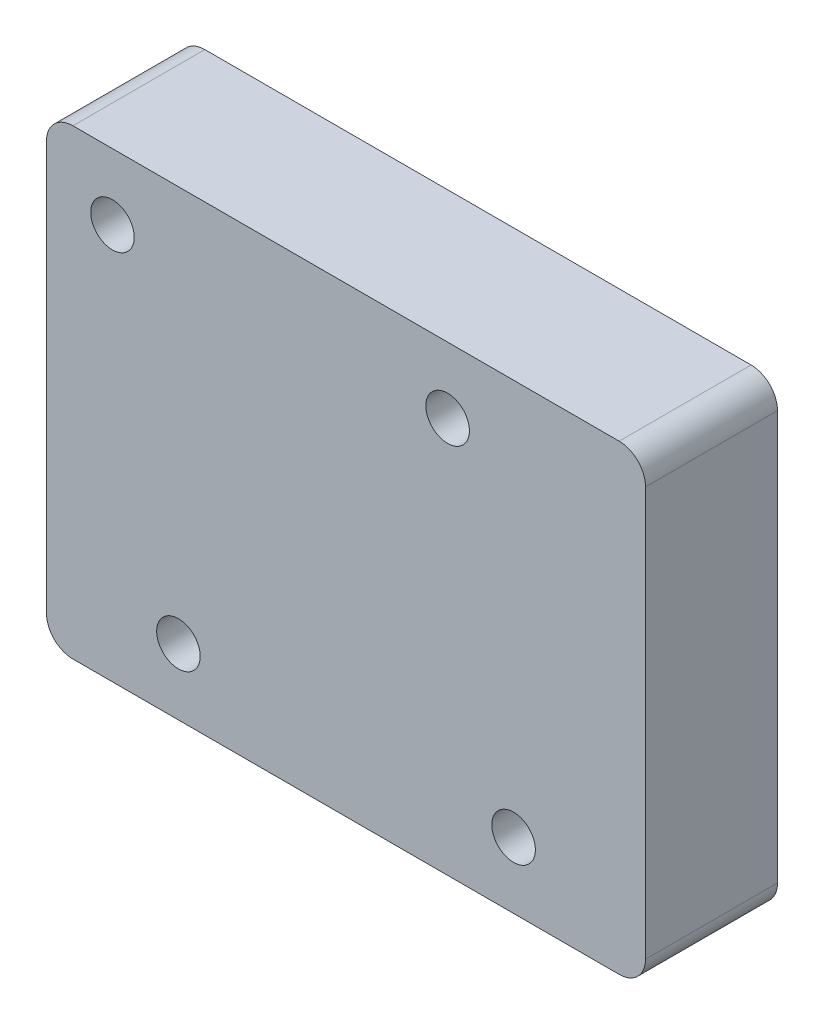
ISO-10303-21;
HEADER;
FILE_DESCRIPTION(('STEP AP214'),'2;1');
FILE_NAME('part.step','',(''),(''),'','','');
FILE_SCHEMA(('AUTOMOTIVE_DESIGN { 1 0 10303 214 1 1 1 1 }'));
ENDSEC;
DATA;
#1=APPLICATION_CONTEXT('core data for automotive mechanical design processes');
#2=APPLICATION_PROTOCOL_DEFINITION('international standard','automotive_design',2000,#1);
#3=PRODUCT_CONTEXT('',#1,'mechanical');
#4=PRODUCT('Part','Part','',(#3));
#5=PRODUCT_RELATED_PRODUCT_CATEGORY('part','',(#4));
#6=PRODUCT_DEFINITION_FORMATION('','',#4);
#7=PRODUCT_DEFINITION_CONTEXT('part definition',#1,'design');
#8=PRODUCT_DEFINITION('design','',#6,#7);
#9=PRODUCT_DEFINITION_SHAPE('','',#8);
#10=(LENGTH_UNIT() NAMED_UNIT(*) SI_UNIT(.MILLI.,.METRE.));
#11=(NAMED_UNIT(*) PLANE_ANGLE_UNIT() SI_UNIT($,.RADIAN.));
#12=(NAMED_UNIT(*) SI_UNIT($,.STERADIAN.) SOLID_ANGLE_UNIT());
#13=UNCERTAINTY_MEASURE_WITH_UNIT(LENGTH_MEASURE(1.E-05),#10,'distance_accuracy_value','');
#14=(GEOMETRIC_REPRESENTATION_CONTEXT(3) GLOBAL_UNCERTAINTY_ASSIGNED_CONTEXT((#13)) GLOBAL_UNIT_ASSIGNED_CONTEXT((#10,
#11,#12)) REPRESENTATION_CONTEXT('',''));
#15=CARTESIAN_POINT('',(0.,0.,0.));
#16=DIRECTION('',(0.,0.,1.));
#17=DIRECTION('',(1.,0.,0.));
#18=AXIS2_PLACEMENT_3D('',#15,#16,#17);
#19=CARTESIAN_POINT('',(0.,0.,10.));
#20=DIRECTION('',(0.,0.,-1.));
#21=DIRECTION('',(-1.,0.,0.));
#22=AXIS2_PLACEMENT_3D('',#19,#20,#21);
#23=PLANE('',#22);
#24=DIRECTION('',(1.,0.,0.));
#25=VECTOR('',#24,1.);
#26=CARTESIAN_POINT('',(0.,0.,10.));
#27=LINE('',#26,#25);
#28=CARTESIAN_POINT('',(2.,0.,10.));
#29=VERTEX_POINT('',#28);
#30=CARTESIAN_POINT('',(43.4,0.,10.));
#31=VERTEX_POINT('',#30);
#32=EDGE_CURVE('E243',#29,#31,#27,.T.);
#33=ORIENTED_EDGE('',*,*,#32,.T.);
#34=CARTESIAN_POINT('',(43.4,2.,10.));
#35=DIRECTION('',(0.,0.,-1.));
#36=DIRECTION('',(-1.,0.,0.));
#37=AXIS2_PLACEMENT_3D('',#34,#35,#36);
#38=CIRCLE('',#37,2.);
#39=CARTESIAN_POINT('',(45.4,2.,10.));
#40=VERTEX_POINT('',#39);
#41=EDGE_CURVE('E149',#31,#40,#38,.F.);
#42=ORIENTED_EDGE('',*,*,#41,.T.);
#43=DIRECTION('',(0.,1.,0.));
#44=VECTOR('',#43,1.);
#45=CARTESIAN_POINT('',(45.4,0.,10.));
#46=LINE('',#45,#44);
#47=CARTESIAN_POINT('',(45.4,33.,10.));
#48=VERTEX_POINT('',#47);
#49=EDGE_CURVE('E236',#40,#48,#46,.T.);
#50=ORIENTED_EDGE('',*,*,#49,.T.);
#51=CARTESIAN_POINT('',(43.4,33.,10.));
#52=DIRECTION('',(0.,0.,-1.));
#53=DIRECTION('',(-1.,0.,0.));
#54=AXIS2_PLACEMENT_3D('',#51,#52,#53);
#55=CIRCLE('',#54,2.);
#56=CARTESIAN_POINT('',(43.4,35.,10.));
#57=VERTEX_POINT('',#56);
#58=EDGE_CURVE('E147',#48,#57,#55,.F.);
#59=ORIENTED_EDGE('',*,*,#58,.T.);
#60=DIRECTION('',(-1.,0.,0.));
#61=VECTOR('',#60,1.);
#62=CARTESIAN_POINT('',(0.,35.,10.));
#63=LINE('',#62,#61);
#64=CARTESIAN_POINT('',(2.,35.,10.));
#65=VERTEX_POINT('',#64);
#66=EDGE_CURVE('E233',#57,#65,#63,.T.);
#67=ORIENTED_EDGE('',*,*,#66,.T.);
#68=CARTESIAN_POINT('',(2.,33.,10.));
#69=DIRECTION('',(0.,0.,-1.));
#70=DIRECTION('',(-1.,0.,0.));
#71=AXIS2_PLACEMENT_3D('',#68,#69,#70);
#72=CIRCLE('',#71,2.);
#73=CARTESIAN_POINT('',(0.,33.,10.));
#74=VERTEX_POINT('',#73);
#75=EDGE_CURVE('E143',#65,#74,#72,.F.);
#76=ORIENTED_EDGE('',*,*,#75,.T.);
#77=DIRECTION('',(0.,-1.,0.));
#78=VECTOR('',#77,1.);
#79=CARTESIAN_POINT('',(0.,0.,10.));
#80=LINE('',#79,#78);
#81=CARTESIAN_POINT('',(0.,2.,10.));
#82=VERTEX_POINT('',#81);
#83=EDGE_CURVE('E257',#74,#82,#80,.T.);
#84=ORIENTED_EDGE('',*,*,#83,.T.);
#85=CARTESIAN_POINT('',(2.,2.,10.));
#86=DIRECTION('',(0.,0.,-1.));
#87=DIRECTION('',(-1.,0.,0.));
#88=AXIS2_PLACEMENT_3D('',#85,#86,#87);
#89=CIRCLE('',#88,2.);
#90=EDGE_CURVE('E145',#82,#29,#89,.F.);
#91=ORIENTED_EDGE('',*,*,#90,.T.);
#92=EDGE_LOOP('',(#33,#42,#50,#59,#67,#76,#84,#91));
#93=FACE_BOUND('',#92,.T.);
#94=CARTESIAN_POINT('',(10.,5.,10.));
#95=DIRECTION('',(0.,0.,1.));
#96=DIRECTION('',(1.,0.,0.));
#97=AXIS2_PLACEMENT_3D('',#94,#95,#96);
#98=CIRCLE('',#97,1.65);
#99=CARTESIAN_POINT('',(11.65,5.,10.));
#100=VERTEX_POINT('',#99);
#101=EDGE_CURVE('E251',#100,#100,#98,.T.);
#102=ORIENTED_EDGE('',*,*,#101,.F.);
#103=EDGE_LOOP('',(#102));
#104=FACE_BOUND('',#103,.T.);
#105=CARTESIAN_POINT('',(35.4,5.,10.));
#106=DIRECTION('',(0.,0.,1.));
#107=DIRECTION('',(1.,0.,0.));
#108=AXIS2_PLACEMENT_3D('',#105,#106,#107);
#109=CIRCLE('',#108,1.65);
#110=CARTESIAN_POINT('',(37.05,5.,10.));
#111=VERTEX_POINT('',#110);
#112=EDGE_CURVE('E290',#111,#111,#109,.T.);
#113=ORIENTED_EDGE('',*,*,#112,.F.);
#114=EDGE_LOOP('',(#113));
#115=FACE_BOUND('',#114,.T.);
#116=CARTESIAN_POINT('',(5.,30.,10.));
#117=DIRECTION('',(0.,0.,1.));
#118=DIRECTION('',(1.,0.,0.));
#119=AXIS2_PLACEMENT_3D('',#116,#117,#118);
#120=CIRCLE('',#119,1.65);
#121=CARTESIAN_POINT('',(6.65,30.,10.));
#122=VERTEX_POINT('',#121);
#123=EDGE_CURVE('E284',#122,#122,#120,.T.);
#124=ORIENTED_EDGE('',*,*,#123,.F.);
#125=EDGE_LOOP('',(#124));
#126=FACE_BOUND('',#125,.T.);
#127=CARTESIAN_POINT('',(30.4,30.,10.));
#128=DIRECTION('',(0.,0.,1.));
#129=DIRECTION('',(1.,0.,0.));
#130=AXIS2_PLACEMENT_3D('',#127,#128,#129);
#131=CIRCLE('',#130,1.65);
#132=CARTESIAN_POINT('',(32.05,30.,10.));
#133=VERTEX_POINT('',#132);
#134=EDGE_CURVE('E277',#133,#133,#131,.T.);
#135=ORIENTED_EDGE('',*,*,#134,.F.);
#136=EDGE_LOOP('',(#135));
#137=FACE_BOUND('',#136,.T.);
#138=ADVANCED_FACE('F33',(#93,#104,#115,#126,#137),#23,.F.);
#139=CARTESIAN_POINT('',(0.,0.,0.));
#140=DIRECTION('',(0.,0.,-1.));
#141=DIRECTION('',(-1.,0.,0.));
#142=AXIS2_PLACEMENT_3D('',#139,#140,#141);
#143=PLANE('',#142);
#144=CARTESIAN_POINT('',(5.,30.,0.));
#145=DIRECTION('',(0.,0.,1.));
#146=DIRECTION('',(1.,0.,0.));
#147=AXIS2_PLACEMENT_3D('',#144,#145,#146);
#148=CIRCLE('',#147,1.65);
#149=CARTESIAN_POINT('',(6.65,30.,0.));
#150=VERTEX_POINT('',#149);
#151=EDGE_CURVE('E280',#150,#150,#148,.T.);
#152=ORIENTED_EDGE('',*,*,#151,.T.);
#153=EDGE_LOOP('',(#152));
#154=FACE_BOUND('',#153,.T.);
#155=CARTESIAN_POINT('',(10.,5.,0.));
#156=DIRECTION('',(0.,0.,1.));
#157=DIRECTION('',(1.,0.,0.));
#158=AXIS2_PLACEMENT_3D('',#155,#156,#157);
#159=CIRCLE('',#158,1.65);
#160=CARTESIAN_POINT('',(11.65,5.,0.));
#161=VERTEX_POINT('',#160);
#162=EDGE_CURVE('E293',#161,#161,#159,.T.);
#163=ORIENTED_EDGE('',*,*,#162,.T.);
#164=EDGE_LOOP('',(#163));
#165=FACE_BOUND('',#164,.T.);
#166=DIRECTION('',(0.,1.,0.));
#167=VECTOR('',#166,1.);
#168=CARTESIAN_POINT('',(45.4,0.,0.));
#169=LINE('',#168,#167);
#170=CARTESIAN_POINT('',(45.4,2.,0.));
#171=VERTEX_POINT('',#170);
#172=CARTESIAN_POINT('',(45.4,33.,0.));
#173=VERTEX_POINT('',#172);
#174=EDGE_CURVE('E253',#171,#173,#169,.T.);
#175=ORIENTED_EDGE('',*,*,#174,.F.);
#176=CARTESIAN_POINT('',(43.4,2.,0.));
#177=DIRECTION('',(0.,0.,-1.));
#178=DIRECTION('',(-1.,0.,0.));
#179=AXIS2_PLACEMENT_3D('',#176,#177,#178);
#180=CIRCLE('',#179,2.);
#181=CARTESIAN_POINT('',(43.4,0.,0.));
#182=VERTEX_POINT('',#181);
#183=EDGE_CURVE('E133',#171,#182,#180,.T.);
#184=ORIENTED_EDGE('',*,*,#183,.T.);
#185=DIRECTION('',(1.,0.,0.));
#186=VECTOR('',#185,1.);
#187=CARTESIAN_POINT('',(0.,0.,0.));
#188=LINE('',#187,#186);
#189=CARTESIAN_POINT('',(2.,0.,0.));
#190=VERTEX_POINT('',#189);
#191=EDGE_CURVE('E250',#190,#182,#188,.T.);
#192=ORIENTED_EDGE('',*,*,#191,.F.);
#193=CARTESIAN_POINT('',(2.,2.,0.));
#194=DIRECTION('',(0.,0.,-1.));
#195=DIRECTION('',(-1.,0.,0.));
#196=AXIS2_PLACEMENT_3D('',#193,#194,#195);
#197=CIRCLE('',#196,2.);
#198=CARTESIAN_POINT('',(0.,2.,0.));
#199=VERTEX_POINT('',#198);
#200=EDGE_CURVE('E131',#190,#199,#197,.T.);
#201=ORIENTED_EDGE('',*,*,#200,.T.);
#202=DIRECTION('',(0.,-1.,0.));
#203=VECTOR('',#202,1.);
#204=CARTESIAN_POINT('',(0.,0.,0.));
#205=LINE('',#204,#203);
#206=CARTESIAN_POINT('',(0.,33.,0.));
#207=VERTEX_POINT('',#206);
#208=EDGE_CURVE('E247',#207,#199,#205,.T.);
#209=ORIENTED_EDGE('',*,*,#208,.F.);
#210=CARTESIAN_POINT('',(2.,33.,0.));
#211=DIRECTION('',(0.,0.,-1.));
#212=DIRECTION('',(-1.,0.,0.));
#213=AXIS2_PLACEMENT_3D('',#210,#211,#212);
#214=CIRCLE('',#213,2.);
#215=CARTESIAN_POINT('',(2.,35.,0.));
#216=VERTEX_POINT('',#215);
#217=EDGE_CURVE('E261',#207,#216,#214,.T.);
#218=ORIENTED_EDGE('',*,*,#217,.T.);
#219=DIRECTION('',(-1.,0.,0.));
#220=VECTOR('',#219,1.);
#221=CARTESIAN_POINT('',(0.,35.,0.));
#222=LINE('',#221,#220);
#223=CARTESIAN_POINT('',(43.4,35.,0.));
#224=VERTEX_POINT('',#223);
#225=EDGE_CURVE('E256',#224,#216,#222,.T.);
#226=ORIENTED_EDGE('',*,*,#225,.F.);
#227=CARTESIAN_POINT('',(43.4,33.,0.));
#228=DIRECTION('',(0.,0.,-1.));
#229=DIRECTION('',(-1.,0.,0.));
#230=AXIS2_PLACEMENT_3D('',#227,#228,#229);
#231=CIRCLE('',#230,2.);
#232=EDGE_CURVE('E136',#224,#173,#231,.T.);
#233=ORIENTED_EDGE('',*,*,#232,.T.);
#234=EDGE_LOOP('',(#175,#184,#192,#201,#209,#218,#226,#233));
#235=FACE_BOUND('',#234,.T.);
#236=CARTESIAN_POINT('',(35.4,5.,0.));
#237=DIRECTION('',(0.,0.,1.));
#238=DIRECTION('',(1.,0.,0.));
#239=AXIS2_PLACEMENT_3D('',#236,#237,#238);
#240=CIRCLE('',#239,1.65);
#241=CARTESIAN_POINT('',(37.05,5.,0.));
#242=VERTEX_POINT('',#241);
#243=EDGE_CURVE('E287',#242,#242,#240,.T.);
#244=ORIENTED_EDGE('',*,*,#243,.T.);
#245=EDGE_LOOP('',(#244));
#246=FACE_BOUND('',#245,.T.);
#247=CARTESIAN_POINT('',(30.4,30.,0.));
#248=DIRECTION('',(0.,0.,1.));
#249=DIRECTION('',(1.,0.,0.));
#250=AXIS2_PLACEMENT_3D('',#247,#248,#249);
#251=CIRCLE('',#250,1.65);
#252=CARTESIAN_POINT('',(32.05,30.,0.));
#253=VERTEX_POINT('',#252);
#254=EDGE_CURVE('E281',#253,#253,#251,.T.);
#255=ORIENTED_EDGE('',*,*,#254,.T.);
#256=EDGE_LOOP('',(#255));
#257=FACE_BOUND('',#256,.T.);
#258=ADVANCED_FACE('F198',(#154,#165,#235,#246,#257),#143,.T.);
#259=CARTESIAN_POINT('',(0.,0.,10.));
#260=DIRECTION('',(1.,0.,0.));
#261=DIRECTION('',(0.,0.,-1.));
#262=AXIS2_PLACEMENT_3D('',#259,#260,#261);
#263=PLANE('',#262);
#264=ORIENTED_EDGE('',*,*,#208,.T.);
#265=DIRECTION('',(0.,0.,-1.));
#266=VECTOR('',#265,1.);
#267=CARTESIAN_POINT('',(0.,2.,10.));
#268=LINE('',#267,#266);
#269=EDGE_CURVE('E118',#199,#82,#268,.F.);
#270=ORIENTED_EDGE('',*,*,#269,.T.);
#271=ORIENTED_EDGE('',*,*,#83,.F.);
#272=DIRECTION('',(0.,0.,-1.));
#273=VECTOR('',#272,1.);
#274=CARTESIAN_POINT('',(0.,33.,10.));
#275=LINE('',#274,#273);
#276=EDGE_CURVE('E156',#74,#207,#275,.T.);
#277=ORIENTED_EDGE('',*,*,#276,.T.);
#278=EDGE_LOOP('',(#264,#270,#271,#277));
#279=FACE_BOUND('',#278,.T.);
#280=ADVANCED_FACE('F202',(#279),#263,.F.);
#281=CARTESIAN_POINT('',(0.,0.,10.));
#282=DIRECTION('',(0.,1.,0.));
#283=DIRECTION('',(0.,0.,1.));
#284=AXIS2_PLACEMENT_3D('',#281,#282,#283);
#285=PLANE('',#284);
#286=DIRECTION('',(0.,0.,-1.));
#287=VECTOR('',#286,1.);
#288=CARTESIAN_POINT('',(2.,0.,10.));
#289=LINE('',#288,#287);
#290=CARTESIAN_POINT('',(2.,0.,6.49415527974839));
#291=VERTEX_POINT('',#290);
#292=EDGE_CURVE('E125',#29,#291,#289,.T.);
#293=ORIENTED_EDGE('',*,*,#292,.T.);
#294=CARTESIAN_POINT('',(2.7,0.,5.));
#295=DIRECTION('',(0.,-1.,0.));
#296=DIRECTION('',(0.,0.,-1.));
#297=AXIS2_PLACEMENT_3D('',#294,#295,#296);
#298=CIRCLE('',#297,1.65);
#299=CARTESIAN_POINT('',(2.,0.,3.50584472025161));
#300=VERTEX_POINT('',#299);
#301=EDGE_CURVE('E59',#300,#291,#298,.T.);
#302=ORIENTED_EDGE('',*,*,#301,.F.);
#303=EDGE_CURVE('E122',#300,#190,#289,.T.);
#304=ORIENTED_EDGE('',*,*,#303,.T.);
#305=ORIENTED_EDGE('',*,*,#191,.T.);
#306=DIRECTION('',(0.,0.,-1.));
#307=VECTOR('',#306,1.);
#308=CARTESIAN_POINT('',(43.4,0.,10.));
#309=LINE('',#308,#307);
#310=CARTESIAN_POINT('',(43.4,0.,3.5058447202516));
#311=VERTEX_POINT('',#310);
#312=EDGE_CURVE('E140',#182,#311,#309,.F.);
#313=ORIENTED_EDGE('',*,*,#312,.T.);
#314=CARTESIAN_POINT('',(42.7,0.,5.));
#315=DIRECTION('',(0.,-1.,0.));
#316=DIRECTION('',(0.,0.,-1.));
#317=AXIS2_PLACEMENT_3D('',#314,#315,#316);
#318=CIRCLE('',#317,1.65);
#319=CARTESIAN_POINT('',(43.4,0.,6.4941552797484));
#320=VERTEX_POINT('',#319);
#321=EDGE_CURVE('E52',#320,#311,#318,.T.);
#322=ORIENTED_EDGE('',*,*,#321,.F.);
#323=EDGE_CURVE('E135',#320,#31,#309,.F.);
#324=ORIENTED_EDGE('',*,*,#323,.T.);
#325=ORIENTED_EDGE('',*,*,#32,.F.);
#326=EDGE_LOOP('',(#293,#302,#304,#305,#313,#322,#324,#325));
#327=FACE_BOUND('',#326,.T.);
#328=ADVANCED_FACE('F120',(#327),#285,.F.);
#329=CARTESIAN_POINT('',(45.4,0.,10.));
#330=DIRECTION('',(-1.,0.,0.));
#331=DIRECTION('',(0.,0.,1.));
#332=AXIS2_PLACEMENT_3D('',#329,#330,#331);
#333=PLANE('',#332);
#334=ORIENTED_EDGE('',*,*,#49,.F.);
#335=DIRECTION('',(0.,0.,-1.));
#336=VECTOR('',#335,1.);
#337=CARTESIAN_POINT('',(45.4,2.,10.));
#338=LINE('',#337,#336);
#339=EDGE_CURVE('E241',#40,#171,#338,.T.);
#340=ORIENTED_EDGE('',*,*,#339,.T.);
#341=ORIENTED_EDGE('',*,*,#174,.T.);
#342=DIRECTION('',(0.,0.,-1.));
#343=VECTOR('',#342,1.);
#344=CARTESIAN_POINT('',(45.4,33.,10.));
#345=LINE('',#344,#343);
#346=EDGE_CURVE('E227',#173,#48,#345,.F.);
#347=ORIENTED_EDGE('',*,*,#346,.T.);
#348=EDGE_LOOP('',(#334,#340,#341,#347));
#349=FACE_BOUND('',#348,.T.);
#350=ADVANCED_FACE('F206',(#349),#333,.F.);
#351=CARTESIAN_POINT('',(0.,35.,10.));
#352=DIRECTION('',(0.,-1.,0.));
#353=DIRECTION('',(0.,0.,-1.));
#354=AXIS2_PLACEMENT_3D('',#351,#352,#353);
#355=PLANE('',#354);
#356=ORIENTED_EDGE('',*,*,#66,.F.);
#357=DIRECTION('',(0.,0.,-1.));
#358=VECTOR('',#357,1.);
#359=CARTESIAN_POINT('',(43.4,35.,10.));
#360=LINE('',#359,#358);
#361=EDGE_CURVE('E153',#57,#224,#360,.T.);
#362=ORIENTED_EDGE('',*,*,#361,.T.);
#363=ORIENTED_EDGE('',*,*,#225,.T.);
#364=DIRECTION('',(0.,0.,-1.));
#365=VECTOR('',#364,1.);
#366=CARTESIAN_POINT('',(2.,35.,10.));
#367=LINE('',#366,#365);
#368=EDGE_CURVE('E151',#216,#65,#367,.F.);
#369=ORIENTED_EDGE('',*,*,#368,.T.);
#370=EDGE_LOOP('',(#356,#362,#363,#369));
#371=FACE_BOUND('',#370,.T.);
#372=ADVANCED_FACE('F194',(#371),#355,.F.);
#373=CARTESIAN_POINT('',(10.,5.,10.));
#374=DIRECTION('',(0.,0.,-1.));
#375=DIRECTION('',(-1.,0.,0.));
#376=AXIS2_PLACEMENT_3D('',#373,#374,#375);
#377=CYLINDRICAL_SURFACE('',#376,1.65);
#378=ORIENTED_EDGE('',*,*,#101,.T.);
#379=EDGE_LOOP('',(#378));
#380=FACE_BOUND('',#379,.T.);
#381=ORIENTED_EDGE('',*,*,#162,.F.);
#382=EDGE_LOOP('',(#381));
#383=FACE_BOUND('',#382,.T.);
#384=ADVANCED_FACE('F190',(#380,#383),#377,.F.);
#385=CARTESIAN_POINT('',(35.4,5.,10.));
#386=DIRECTION('',(0.,0.,-1.));
#387=DIRECTION('',(-1.,0.,0.));
#388=AXIS2_PLACEMENT_3D('',#385,#386,#387);
#389=CYLINDRICAL_SURFACE('',#388,1.65);
#390=ORIENTED_EDGE('',*,*,#112,.T.);
#391=EDGE_LOOP('',(#390));
#392=FACE_BOUND('',#391,.T.);
#393=ORIENTED_EDGE('',*,*,#243,.F.);
#394=EDGE_LOOP('',(#393));
#395=FACE_BOUND('',#394,.T.);
#396=ADVANCED_FACE('F186',(#392,#395),#389,.F.);
#397=CARTESIAN_POINT('',(5.,30.,10.));
#398=DIRECTION('',(0.,0.,-1.));
#399=DIRECTION('',(-1.,0.,0.));
#400=AXIS2_PLACEMENT_3D('',#397,#398,#399);
#401=CYLINDRICAL_SURFACE('',#400,1.65);
#402=ORIENTED_EDGE('',*,*,#123,.T.);
#403=EDGE_LOOP('',(#402));
#404=FACE_BOUND('',#403,.T.);
#405=ORIENTED_EDGE('',*,*,#151,.F.);
#406=EDGE_LOOP('',(#405));
#407=FACE_BOUND('',#406,.T.);
#408=ADVANCED_FACE('F182',(#404,#407),#401,.F.);
#409=CARTESIAN_POINT('',(30.4,30.,10.));
#410=DIRECTION('',(0.,0.,-1.));
#411=DIRECTION('',(-1.,0.,0.));
#412=AXIS2_PLACEMENT_3D('',#409,#410,#411);
#413=CYLINDRICAL_SURFACE('',#412,1.65);
#414=ORIENTED_EDGE('',*,*,#134,.T.);
#415=EDGE_LOOP('',(#414));
#416=FACE_BOUND('',#415,.T.);
#417=ORIENTED_EDGE('',*,*,#254,.F.);
#418=EDGE_LOOP('',(#417));
#419=FACE_BOUND('',#418,.T.);
#420=ADVANCED_FACE('F178',(#416,#419),#413,.F.);
#421=CARTESIAN_POINT('',(43.4,2.,10.));
#422=DIRECTION('',(0.,0.,-1.));
#423=DIRECTION('',(-1.,0.,0.));
#424=AXIS2_PLACEMENT_3D('',#421,#422,#423);
#425=CYLINDRICAL_SURFACE('',#424,2.);
#426=CARTESIAN_POINT('',(43.4,0.,3.5058447202516));
#427=CARTESIAN_POINT('',(43.4399757612222,-3.89181394944357E-06,3.52456872621886));
#428=CARTESIAN_POINT('',(43.4791625342817,0.00119888612951132,3.54488883594793));
#429=CARTESIAN_POINT('',(43.5556585003642,0.00569967627753721,3.58851733323184));
#430=CARTESIAN_POINT('',(43.5929696127101,0.00899549759671947,3.611822575771));
#431=CARTESIAN_POINT('',(43.7012924224175,0.0214961890845653,3.68565316394828));
#432=CARTESIAN_POINT('',(43.7692195538894,0.0333226077774278,3.74034164085758));
#433=CARTESIAN_POINT('',(43.8949171432771,0.0611341886525545,3.85889078036506));
#434=CARTESIAN_POINT('',(43.9527225539762,0.0771045467039445,3.92271843685627));
#435=CARTESIAN_POINT('',(44.057712978826,0.110436164796448,4.05846350486909));
#436=CARTESIAN_POINT('',(44.1048756606957,0.127800247815508,4.1303974610059));
#437=CARTESIAN_POINT('',(44.1913190913479,0.162561173001247,4.2877949007274));
#438=CARTESIAN_POINT('',(44.2295084698494,0.179820318465281,4.37389337597685));
#439=CARTESIAN_POINT('',(44.290827147344,0.209024004684257,4.55209280076296));
#440=CARTESIAN_POINT('',(44.31397653957,0.22097562943219,4.64418556017863));
#441=CARTESIAN_POINT('',(44.3434032567434,0.236406681389137,4.82713794964522));
#442=CARTESIAN_POINT('',(44.3504461192564,0.240269744648488,4.9178398673341));
#443=CARTESIAN_POINT('',(44.3495102639514,0.23976353095927,5.0991269181172));
#444=CARTESIAN_POINT('',(44.3415358439912,0.235396609383723,5.18971207720255));
#445=CARTESIAN_POINT('',(44.3124582183389,0.220211754458979,5.35945870671061));
#446=CARTESIAN_POINT('',(44.2926318999422,0.210025042978895,5.43890388817838));
#447=CARTESIAN_POINT('',(44.241727044478,0.185533383569328,5.59346911388847));
#448=CARTESIAN_POINT('',(44.2106389697905,0.171224947046699,5.66858542931126));
#449=CARTESIAN_POINT('',(44.1348285021419,0.139392751610247,5.81945774409304));
#450=CARTESIAN_POINT('',(44.0891525133206,0.121697321864955,5.89469672277718));
#451=CARTESIAN_POINT('',(43.9863526954812,0.0871173115279445,6.03705686064095));
#452=CARTESIAN_POINT('',(43.9292404273988,0.0702319332524747,6.10418610894788));
#453=CARTESIAN_POINT('',(43.8335459750786,0.0472532198009506,6.19992019436353));
#454=CARTESIAN_POINT('',(43.7986584975559,0.0397872532249038,6.23195002840295));
#455=CARTESIAN_POINT('',(43.7260786188662,0.0264160930191327,6.29302367184319));
#456=CARTESIAN_POINT('',(43.6883869295661,0.0205105049982861,6.32206823464558));
#457=CARTESIAN_POINT('',(43.6102201735095,0.0106872857017105,6.37705960824369));
#458=CARTESIAN_POINT('',(43.5697301087278,0.00678149061808382,6.40298729562373));
#459=CARTESIAN_POINT('',(43.4864730508988,0.00143194567426292,6.45130615861689));
#460=CARTESIAN_POINT('',(43.4437032216756,-8.65996382433877E-06,6.47369278482853));
#461=CARTESIAN_POINT('',(43.4,0.,6.4941552797484));
#462=B_SPLINE_CURVE_WITH_KNOTS('',3,(#426,#427,#428,#429,#430,#431,#432,#433,#434,#435,#436,
#437,#438,#439,#440,#441,#442,#443,#444,#445,#446,#447,#448,#449,#450,#451,#452,#453,#454,#455,
#456,#457,#458,#459,#460,#461),.UNSPECIFIED.,.F.,.F.,(4,2,2,2,2,2,2,2,2,2,2,2,2,2,2,2,2,4),(0.,
0.132313868197939,0.264489465116407,0.527121430968819,0.788827767143324,1.05107825410744,
1.33693094177274,1.62240094422475,1.89399255482151,2.16550644930778,2.41201235489665,
2.65872751712978,2.92698846319067,3.19497958098533,3.33864908114201,3.48228223351898,
3.62675595692052,3.77141381214626),.UNSPECIFIED.);
#463=EDGE_CURVE('E11',#311,#320,#462,.T.);
#464=ORIENTED_EDGE('',*,*,#463,.F.);
#465=ORIENTED_EDGE('',*,*,#312,.F.);
#466=ORIENTED_EDGE('',*,*,#183,.F.);
#467=ORIENTED_EDGE('',*,*,#339,.F.);
#468=ORIENTED_EDGE('',*,*,#41,.F.);
#469=ORIENTED_EDGE('',*,*,#323,.F.);
#470=EDGE_LOOP('',(#464,#465,#466,#467,#468,#469));
#471=FACE_BOUND('',#470,.T.);
#472=ADVANCED_FACE('F181',(#471),#425,.T.);
#473=CARTESIAN_POINT('',(43.4,33.,10.));
#474=DIRECTION('',(0.,0.,-1.));
#475=DIRECTION('',(-1.,0.,0.));
#476=AXIS2_PLACEMENT_3D('',#473,#474,#475);
#477=CYLINDRICAL_SURFACE('',#476,2.);
#478=ORIENTED_EDGE('',*,*,#58,.F.);
#479=ORIENTED_EDGE('',*,*,#346,.F.);
#480=ORIENTED_EDGE('',*,*,#232,.F.);
#481=ORIENTED_EDGE('',*,*,#361,.F.);
#482=EDGE_LOOP('',(#478,#479,#480,#481));
#483=FACE_BOUND('',#482,.T.);
#484=ADVANCED_FACE('F217',(#483),#477,.T.);
#485=CARTESIAN_POINT('',(2.,2.,10.));
#486=DIRECTION('',(0.,0.,-1.));
#487=DIRECTION('',(-1.,0.,0.));
#488=AXIS2_PLACEMENT_3D('',#485,#486,#487);
#489=CYLINDRICAL_SURFACE('',#488,2.);
#490=CARTESIAN_POINT('',(2.,0.,6.49415527974839));
#491=CARTESIAN_POINT('',(1.96002423877776,-3.89181394966276E-06,6.47543127378113));
#492=CARTESIAN_POINT('',(1.92083746571829,0.00119888612951119,6.45511116405207));
#493=CARTESIAN_POINT('',(1.84434149963578,0.00569967627753733,6.41148266676816));
#494=CARTESIAN_POINT('',(1.80703038728992,0.00899549759671965,6.388177424229));
#495=CARTESIAN_POINT('',(1.69870757758252,0.0214961890845655,6.31434683605172));
#496=CARTESIAN_POINT('',(1.63078044611057,0.0333226077774278,6.25965835914242));
#497=CARTESIAN_POINT('',(1.50508285672293,0.0611341886525539,6.14110921963494));
#498=CARTESIAN_POINT('',(1.44727744602379,0.0771045467039436,6.07728156314373));
#499=CARTESIAN_POINT('',(1.34228702117401,0.110436164796447,5.94153649513091));
#500=CARTESIAN_POINT('',(1.29512433930434,0.127800247815507,5.8696025389941));
#501=CARTESIAN_POINT('',(1.20868090865208,0.162561173001246,5.7122050992726));
#502=CARTESIAN_POINT('',(1.17049153015065,0.17982031846528,5.62610662402315));
#503=CARTESIAN_POINT('',(1.10917285265596,0.209024004684256,5.44790719923704));
#504=CARTESIAN_POINT('',(1.08602346043003,0.220975629432189,5.35581443982137));
#505=CARTESIAN_POINT('',(1.05659674325664,0.236406681389135,5.17286205035477));
#506=CARTESIAN_POINT('',(1.04955388074355,0.240269744648486,5.0821601326659));
#507=CARTESIAN_POINT('',(1.05048973604865,0.239763530959268,4.90087308188279));
#508=CARTESIAN_POINT('',(1.05846415600884,0.235396609383721,4.81028792279744));
#509=CARTESIAN_POINT('',(1.08754178166113,0.220211754458977,4.64054129328938));
#510=CARTESIAN_POINT('',(1.10736810005779,0.210025042978893,4.56109611182161));
#511=CARTESIAN_POINT('',(1.15827295552199,0.185533383569325,4.40653088611153));
#512=CARTESIAN_POINT('',(1.1893610302095,0.171224947046697,4.33141457068873));
#513=CARTESIAN_POINT('',(1.26517149785816,0.139392751610245,4.18054225590696));
#514=CARTESIAN_POINT('',(1.31084748667941,0.121697321864953,4.10530327722281));
#515=CARTESIAN_POINT('',(1.41364730451877,0.087117311527943,3.96294313935905));
#516=CARTESIAN_POINT('',(1.47075957260117,0.0702319332524733,3.89581389105212));
#517=CARTESIAN_POINT('',(1.56645402492145,0.0472532198009497,3.80007980563647));
#518=CARTESIAN_POINT('',(1.6013415024441,0.0397872532249031,3.76804997159705));
#519=CARTESIAN_POINT('',(1.67392138113377,0.0264160930191317,3.7069763281568));
#520=CARTESIAN_POINT('',(1.71161307043386,0.0205105049982846,3.67793176535442));
#521=CARTESIAN_POINT('',(1.78977982649054,0.010687285701709,3.62294039175631));
#522=CARTESIAN_POINT('',(1.83026989127225,0.00678149061808278,3.59701270437627));
#523=CARTESIAN_POINT('',(1.91352694910118,0.00143194567426292,3.54869384138311));
#524=CARTESIAN_POINT('',(1.95629677832439,-8.6599638239601E-06,3.52630721517147));
#525=CARTESIAN_POINT('',(2.,0.,3.50584472025161));
#526=B_SPLINE_CURVE_WITH_KNOTS('',3,(#490,#491,#492,#493,#494,#495,#496,#497,#498,#499,#500,
#501,#502,#503,#504,#505,#506,#507,#508,#509,#510,#511,#512,#513,#514,#515,#516,#517,#518,#519,
#520,#521,#522,#523,#524,#525),.UNSPECIFIED.,.F.,.F.,(4,2,2,2,2,2,2,2,2,2,2,2,2,2,2,2,2,4),(0.,
0.132313868197941,0.264489465116405,0.527121430968819,0.788827767143322,1.05107825410743,
1.33693094177273,1.62240094422475,1.89399255482151,2.16550644930778,2.41201235489665,
2.65872751712978,2.92698846319067,3.19497958098533,3.33864908114201,3.48228223351898,
3.62675595692052,3.77141381214625),.UNSPECIFIED.);
#527=EDGE_CURVE('E47',#291,#300,#526,.T.);
#528=ORIENTED_EDGE('',*,*,#527,.F.);
#529=ORIENTED_EDGE('',*,*,#292,.F.);
#530=ORIENTED_EDGE('',*,*,#90,.F.);
#531=ORIENTED_EDGE('',*,*,#269,.F.);
#532=ORIENTED_EDGE('',*,*,#200,.F.);
#533=ORIENTED_EDGE('',*,*,#303,.F.);
#534=EDGE_LOOP('',(#528,#529,#530,#531,#532,#533));
#535=FACE_BOUND('',#534,.T.);
#536=ADVANCED_FACE('F129',(#535),#489,.T.);
#537=CARTESIAN_POINT('',(2.,33.,10.));
#538=DIRECTION('',(0.,0.,-1.));
#539=DIRECTION('',(-1.,0.,0.));
#540=AXIS2_PLACEMENT_3D('',#537,#538,#539);
#541=CYLINDRICAL_SURFACE('',#540,2.);
#542=ORIENTED_EDGE('',*,*,#75,.F.);
#543=ORIENTED_EDGE('',*,*,#368,.F.);
#544=ORIENTED_EDGE('',*,*,#217,.F.);
#545=ORIENTED_EDGE('',*,*,#276,.F.);
#546=EDGE_LOOP('',(#542,#543,#544,#545));
#547=FACE_BOUND('',#546,.T.);
#548=ADVANCED_FACE('F35',(#547),#541,.T.);
#549=CARTESIAN_POINT('',(2.7,10.,5.));
#550=DIRECTION('',(0.,-1.,0.));
#551=DIRECTION('',(0.,0.,-1.));
#552=AXIS2_PLACEMENT_3D('',#549,#550,#551);
#553=CYLINDRICAL_SURFACE('',#552,1.65);
#554=ORIENTED_EDGE('',*,*,#527,.T.);
#555=ORIENTED_EDGE('',*,*,#301,.T.);
#556=EDGE_LOOP('',(#554,#555));
#557=FACE_BOUND('',#556,.T.);
#558=CARTESIAN_POINT('',(2.7,10.,5.));
#559=DIRECTION('',(0.,-1.,0.));
#560=DIRECTION('',(0.,0.,-1.));
#561=AXIS2_PLACEMENT_3D('',#558,#559,#560);
#562=CIRCLE('',#561,1.65);
#563=CARTESIAN_POINT('',(2.7,10.,3.35));
#564=VERTEX_POINT('',#563);
#565=EDGE_CURVE('E126',#564,#564,#562,.T.);
#566=ORIENTED_EDGE('',*,*,#565,.F.);
#567=EDGE_LOOP('',(#566));
#568=FACE_BOUND('',#567,.T.);
#569=ADVANCED_FACE('F112',(#557,#568),#553,.F.);
#570=CARTESIAN_POINT('',(2.7,10.,5.));
#571=DIRECTION('',(0.,-1.,0.));
#572=DIRECTION('',(0.,0.,-1.));
#573=AXIS2_PLACEMENT_3D('',#570,#571,#572);
#574=PLANE('',#573);
#575=ORIENTED_EDGE('',*,*,#565,.T.);
#576=EDGE_LOOP('',(#575));
#577=FACE_BOUND('',#576,.T.);
#578=ADVANCED_FACE('F170',(#577),#574,.T.);
#579=CARTESIAN_POINT('',(42.7,10.,5.));
#580=DIRECTION('',(0.,-1.,0.));
#581=DIRECTION('',(0.,0.,-1.));
#582=AXIS2_PLACEMENT_3D('',#579,#580,#581);
#583=CYLINDRICAL_SURFACE('',#582,1.65);
#584=ORIENTED_EDGE('',*,*,#463,.T.);
#585=ORIENTED_EDGE('',*,*,#321,.T.);
#586=EDGE_LOOP('',(#584,#585));
#587=FACE_BOUND('',#586,.T.);
#588=CARTESIAN_POINT('',(42.7,10.,5.));
#589=DIRECTION('',(0.,-1.,0.));
#590=DIRECTION('',(0.,0.,-1.));
#591=AXIS2_PLACEMENT_3D('',#588,#589,#590);
#592=CIRCLE('',#591,1.65);
#593=CARTESIAN_POINT('',(42.7,10.,3.35));
#594=VERTEX_POINT('',#593);
#595=EDGE_CURVE('E127',#594,#594,#592,.T.);
#596=ORIENTED_EDGE('',*,*,#595,.F.);
#597=EDGE_LOOP('',(#596));
#598=FACE_BOUND('',#597,.T.);
#599=ADVANCED_FACE('F173',(#587,#598),#583,.F.);
#600=CARTESIAN_POINT('',(42.7,10.,5.));
#601=DIRECTION('',(0.,-1.,0.));
#602=DIRECTION('',(0.,0.,-1.));
#603=AXIS2_PLACEMENT_3D('',#600,#601,#602);
#604=PLANE('',#603);
#605=ORIENTED_EDGE('',*,*,#595,.T.);
#606=EDGE_LOOP('',(#605));
#607=FACE_BOUND('',#606,.T.);
#608=ADVANCED_FACE('F171',(#607),#604,.T.);
#609=CLOSED_SHELL('',(#138,#258,#280,#328,#350,#372,#384,#396,#408,#420,#472,#484,#536,#548,
#569,#578,#599,#608));
#610=MANIFOLD_SOLID_BREP('B2',#609);
#611=ADVANCED_BREP_SHAPE_REPRESENTATION('',(#18,#610),#14);
#612=SHAPE_DEFINITION_REPRESENTATION(#9,#611);
ENDSEC;
END-ISO-10303-21;
